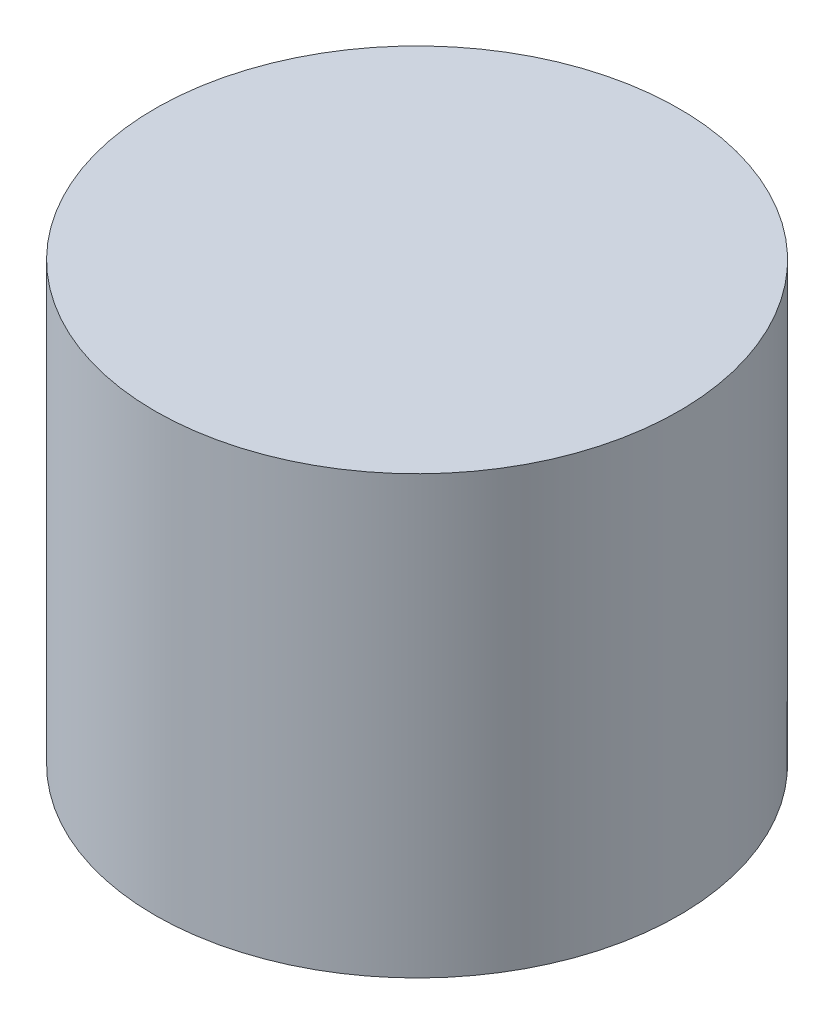
ISO-10303-21;
HEADER;
FILE_DESCRIPTION(('STEP AP214'),'2;1');
FILE_NAME('part.step','',(''),(''),'','','');
FILE_SCHEMA(('AUTOMOTIVE_DESIGN { 1 0 10303 214 1 1 1 1 }'));
ENDSEC;
DATA;
#1=APPLICATION_CONTEXT('core data for automotive mechanical design processes');
#2=APPLICATION_PROTOCOL_DEFINITION('international standard','automotive_design',2000,#1);
#3=PRODUCT_CONTEXT('',#1,'mechanical');
#4=PRODUCT('Part','Part','',(#3));
#5=PRODUCT_RELATED_PRODUCT_CATEGORY('part','',(#4));
#6=PRODUCT_DEFINITION_FORMATION('','',#4);
#7=PRODUCT_DEFINITION_CONTEXT('part definition',#1,'design');
#8=PRODUCT_DEFINITION('design','',#6,#7);
#9=PRODUCT_DEFINITION_SHAPE('','',#8);
#10=(LENGTH_UNIT() NAMED_UNIT(*) SI_UNIT(.MILLI.,.METRE.));
#11=(NAMED_UNIT(*) PLANE_ANGLE_UNIT() SI_UNIT($,.RADIAN.));
#12=(NAMED_UNIT(*) SI_UNIT($,.STERADIAN.) SOLID_ANGLE_UNIT());
#13=UNCERTAINTY_MEASURE_WITH_UNIT(LENGTH_MEASURE(1.E-05),#10,'distance_accuracy_value','');
#14=(GEOMETRIC_REPRESENTATION_CONTEXT(3) GLOBAL_UNCERTAINTY_ASSIGNED_CONTEXT((#13)) GLOBAL_UNIT_ASSIGNED_CONTEXT((#10,
#11,#12)) REPRESENTATION_CONTEXT('',''));
#15=CARTESIAN_POINT('',(0.,0.,0.));
#16=DIRECTION('',(0.,0.,1.));
#17=DIRECTION('',(1.,0.,0.));
#18=AXIS2_PLACEMENT_3D('',#15,#16,#17);
#19=CARTESIAN_POINT('',(0.,50.,0.));
#20=DIRECTION('',(0.,-1.,0.));
#21=DIRECTION('',(0.,0.,-1.));
#22=AXIS2_PLACEMENT_3D('',#19,#20,#21);
#23=CYLINDRICAL_SURFACE('',#22,30.);
#24=CARTESIAN_POINT('',(0.,50.,0.));
#25=DIRECTION('',(0.,1.,0.));
#26=DIRECTION('',(0.,0.,1.));
#27=AXIS2_PLACEMENT_3D('',#24,#25,#26);
#28=CIRCLE('',#27,30.);
#29=CARTESIAN_POINT('',(0.,50.,30.));
#30=VERTEX_POINT('',#29);
#31=EDGE_CURVE('E10',#30,#30,#28,.T.);
#32=ORIENTED_EDGE('',*,*,#31,.F.);
#33=EDGE_LOOP('',(#32));
#34=FACE_BOUND('',#33,.T.);
#35=CARTESIAN_POINT('',(0.,0.,0.));
#36=DIRECTION('',(0.,1.,0.));
#37=DIRECTION('',(0.,0.,1.));
#38=AXIS2_PLACEMENT_3D('',#35,#36,#37);
#39=CIRCLE('',#38,30.);
#40=CARTESIAN_POINT('',(0.,0.,30.));
#41=VERTEX_POINT('',#40);
#42=EDGE_CURVE('E34',#41,#41,#39,.T.);
#43=ORIENTED_EDGE('',*,*,#42,.T.);
#44=EDGE_LOOP('',(#43));
#45=FACE_BOUND('',#44,.T.);
#46=ADVANCED_FACE('F31',(#34,#45),#23,.T.);
#47=CARTESIAN_POINT('',(0.,50.,0.));
#48=DIRECTION('',(0.,1.,0.));
#49=DIRECTION('',(0.,0.,1.));
#50=AXIS2_PLACEMENT_3D('',#47,#48,#49);
#51=PLANE('',#50);
#52=ORIENTED_EDGE('',*,*,#31,.T.);
#53=EDGE_LOOP('',(#52));
#54=FACE_BOUND('',#53,.T.);
#55=ADVANCED_FACE('F46',(#54),#51,.T.);
#56=CARTESIAN_POINT('',(0.,0.,0.));
#57=DIRECTION('',(0.,1.,0.));
#58=DIRECTION('',(0.,0.,1.));
#59=AXIS2_PLACEMENT_3D('',#56,#57,#58);
#60=PLANE('',#59);
#61=ORIENTED_EDGE('',*,*,#42,.F.);
#62=EDGE_LOOP('',(#61));
#63=FACE_BOUND('',#62,.T.);
#64=ADVANCED_FACE('F44',(#63),#60,.F.);
#65=CLOSED_SHELL('',(#46,#55,#64));
#66=MANIFOLD_SOLID_BREP('B2',#65);
#67=ADVANCED_BREP_SHAPE_REPRESENTATION('',(#18,#66),#14);
#68=SHAPE_DEFINITION_REPRESENTATION(#9,#67);
ENDSEC;
END-ISO-10303-21;
